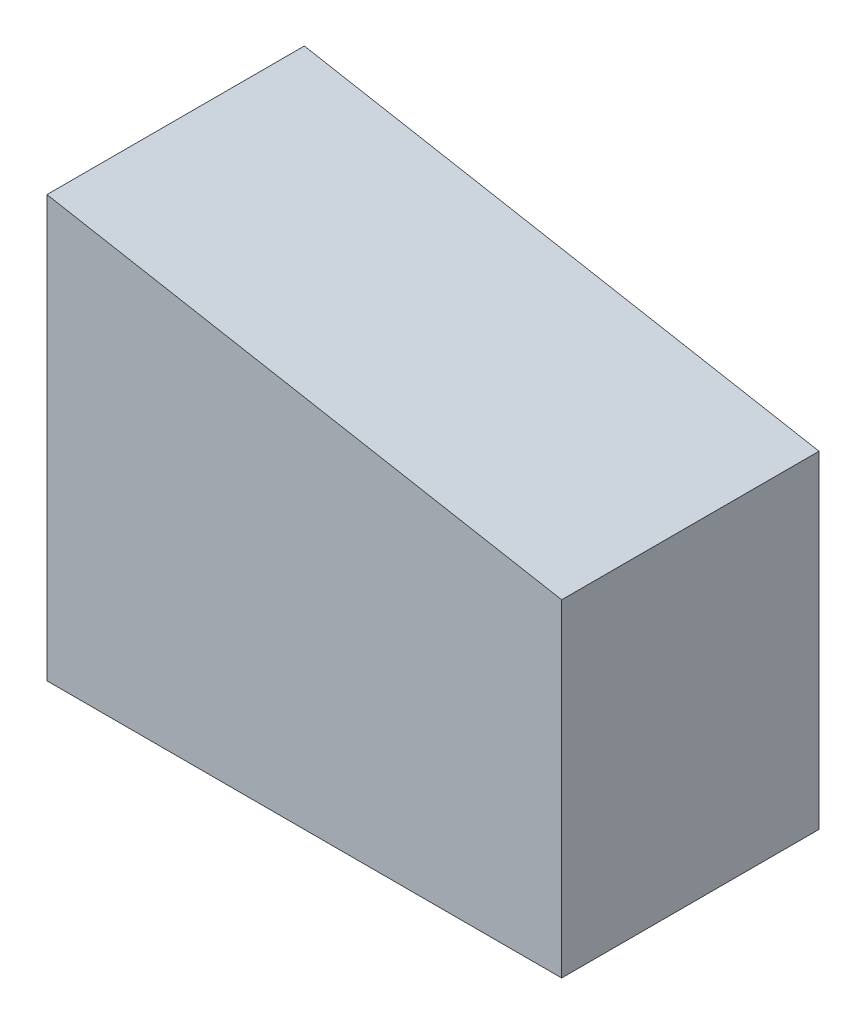
ISO-10303-21;
HEADER;
FILE_DESCRIPTION(('STEP AP214'),'2;1');
FILE_NAME('part.step','',(''),(''),'','','');
FILE_SCHEMA(('AUTOMOTIVE_DESIGN { 1 0 10303 214 1 1 1 1 }'));
ENDSEC;
DATA;
#1=APPLICATION_CONTEXT('core data for automotive mechanical design processes');
#2=APPLICATION_PROTOCOL_DEFINITION('international standard','automotive_design',2000,#1);
#3=PRODUCT_CONTEXT('',#1,'mechanical');
#4=PRODUCT('Part','Part','',(#3));
#5=PRODUCT_RELATED_PRODUCT_CATEGORY('part','',(#4));
#6=PRODUCT_DEFINITION_FORMATION('','',#4);
#7=PRODUCT_DEFINITION_CONTEXT('part definition',#1,'design');
#8=PRODUCT_DEFINITION('design','',#6,#7);
#9=PRODUCT_DEFINITION_SHAPE('','',#8);
#10=(LENGTH_UNIT() NAMED_UNIT(*) SI_UNIT(.MILLI.,.METRE.));
#11=(NAMED_UNIT(*) PLANE_ANGLE_UNIT() SI_UNIT($,.RADIAN.));
#12=(NAMED_UNIT(*) SI_UNIT($,.STERADIAN.) SOLID_ANGLE_UNIT());
#13=UNCERTAINTY_MEASURE_WITH_UNIT(LENGTH_MEASURE(1.E-05),#10,'distance_accuracy_value','');
#14=(GEOMETRIC_REPRESENTATION_CONTEXT(3) GLOBAL_UNCERTAINTY_ASSIGNED_CONTEXT((#13)) GLOBAL_UNIT_ASSIGNED_CONTEXT((#10,
#11,#12)) REPRESENTATION_CONTEXT('',''));
#15=CARTESIAN_POINT('',(0.,0.,0.));
#16=DIRECTION('',(0.,0.,1.));
#17=DIRECTION('',(1.,0.,0.));
#18=AXIS2_PLACEMENT_3D('',#15,#16,#17);
#19=CARTESIAN_POINT('',(0.,9.,5.5));
#20=DIRECTION('',(1.,0.,0.));
#21=DIRECTION('',(0.,1.,0.));
#22=AXIS2_PLACEMENT_3D('',#19,#20,#21);
#23=PLANE('',#22);
#24=DIRECTION('',(0.,-1.,0.));
#25=VECTOR('',#24,1.);
#26=CARTESIAN_POINT('',(0.,9.,0.));
#27=LINE('',#26,#25);
#28=CARTESIAN_POINT('',(0.,9.,0.));
#29=VERTEX_POINT('',#28);
#30=CARTESIAN_POINT('',(0.,0.,0.));
#31=VERTEX_POINT('',#30);
#32=EDGE_CURVE('E96',#29,#31,#27,.T.);
#33=ORIENTED_EDGE('',*,*,#32,.T.);
#34=DIRECTION('',(0.,0.,-1.));
#35=VECTOR('',#34,1.);
#36=CARTESIAN_POINT('',(0.,0.,5.5));
#37=LINE('',#36,#35);
#38=CARTESIAN_POINT('',(0.,0.,5.5));
#39=VERTEX_POINT('',#38);
#40=EDGE_CURVE('E11',#39,#31,#37,.T.);
#41=ORIENTED_EDGE('',*,*,#40,.F.);
#42=DIRECTION('',(0.,-1.,0.));
#43=VECTOR('',#42,1.);
#44=CARTESIAN_POINT('',(0.,9.,5.5));
#45=LINE('',#44,#43);
#46=CARTESIAN_POINT('',(0.,9.,5.5));
#47=VERTEX_POINT('',#46);
#48=EDGE_CURVE('E84',#47,#39,#45,.T.);
#49=ORIENTED_EDGE('',*,*,#48,.F.);
#50=DIRECTION('',(0.,0.,-1.));
#51=VECTOR('',#50,1.);
#52=CARTESIAN_POINT('',(0.,9.,5.5));
#53=LINE('',#52,#51);
#54=EDGE_CURVE('E92',#47,#29,#53,.T.);
#55=ORIENTED_EDGE('',*,*,#54,.T.);
#56=EDGE_LOOP('',(#33,#41,#49,#55));
#57=FACE_BOUND('',#56,.T.);
#58=ADVANCED_FACE('F33',(#57),#23,.F.);
#59=CARTESIAN_POINT('',(0.,0.,5.5));
#60=DIRECTION('',(0.,1.,0.));
#61=DIRECTION('',(0.,0.,1.));
#62=AXIS2_PLACEMENT_3D('',#59,#60,#61);
#63=PLANE('',#62);
#64=DIRECTION('',(1.,0.,0.));
#65=VECTOR('',#64,1.);
#66=CARTESIAN_POINT('',(0.,0.,0.));
#67=LINE('',#66,#65);
#68=CARTESIAN_POINT('',(11.,0.,0.));
#69=VERTEX_POINT('',#68);
#70=EDGE_CURVE('E88',#31,#69,#67,.T.);
#71=ORIENTED_EDGE('',*,*,#70,.T.);
#72=DIRECTION('',(0.,0.,-1.));
#73=VECTOR('',#72,1.);
#74=CARTESIAN_POINT('',(11.,0.,5.5));
#75=LINE('',#74,#73);
#76=CARTESIAN_POINT('',(11.,0.,5.5));
#77=VERTEX_POINT('',#76);
#78=EDGE_CURVE('E41',#77,#69,#75,.T.);
#79=ORIENTED_EDGE('',*,*,#78,.F.);
#80=DIRECTION('',(1.,0.,0.));
#81=VECTOR('',#80,1.);
#82=CARTESIAN_POINT('',(0.,0.,5.5));
#83=LINE('',#82,#81);
#84=EDGE_CURVE('E79',#39,#77,#83,.T.);
#85=ORIENTED_EDGE('',*,*,#84,.F.);
#86=ORIENTED_EDGE('',*,*,#40,.T.);
#87=EDGE_LOOP('',(#71,#79,#85,#86));
#88=FACE_BOUND('',#87,.T.);
#89=ADVANCED_FACE('F87',(#88),#63,.F.);
#90=CARTESIAN_POINT('',(11.,0.,5.5));
#91=DIRECTION('',(-1.,0.,0.));
#92=DIRECTION('',(0.,0.,1.));
#93=AXIS2_PLACEMENT_3D('',#90,#91,#92);
#94=PLANE('',#93);
#95=DIRECTION('',(0.,1.,0.));
#96=VECTOR('',#95,1.);
#97=CARTESIAN_POINT('',(11.,0.,0.));
#98=LINE('',#97,#96);
#99=CARTESIAN_POINT('',(11.,7.,0.));
#100=VERTEX_POINT('',#99);
#101=EDGE_CURVE('E66',#69,#100,#98,.T.);
#102=ORIENTED_EDGE('',*,*,#101,.T.);
#103=DIRECTION('',(0.,0.,-1.));
#104=VECTOR('',#103,1.);
#105=CARTESIAN_POINT('',(11.,7.,5.5));
#106=LINE('',#105,#104);
#107=CARTESIAN_POINT('',(11.,7.,5.5));
#108=VERTEX_POINT('',#107);
#109=EDGE_CURVE('E89',#108,#100,#106,.T.);
#110=ORIENTED_EDGE('',*,*,#109,.F.);
#111=DIRECTION('',(0.,1.,0.));
#112=VECTOR('',#111,1.);
#113=CARTESIAN_POINT('',(11.,0.,5.5));
#114=LINE('',#113,#112);
#115=EDGE_CURVE('E82',#77,#108,#114,.T.);
#116=ORIENTED_EDGE('',*,*,#115,.F.);
#117=ORIENTED_EDGE('',*,*,#78,.T.);
#118=EDGE_LOOP('',(#102,#110,#116,#117));
#119=FACE_BOUND('',#118,.T.);
#120=ADVANCED_FACE('F90',(#119),#94,.F.);
#121=CARTESIAN_POINT('',(11.,7.,5.5));
#122=DIRECTION('',(-0.178885438199983,-0.983869910099908,0.));
#123=DIRECTION('',(0.983869910099908,-0.178885438199983,0.));
#124=AXIS2_PLACEMENT_3D('',#121,#122,#123);
#125=PLANE('',#124);
#126=DIRECTION('',(-0.983869910099908,0.178885438199983,0.));
#127=VECTOR('',#126,1.);
#128=CARTESIAN_POINT('',(11.,7.,0.));
#129=LINE('',#128,#127);
#130=EDGE_CURVE('E72',#100,#29,#129,.T.);
#131=ORIENTED_EDGE('',*,*,#130,.T.);
#132=ORIENTED_EDGE('',*,*,#54,.F.);
#133=DIRECTION('',(-0.983869910099908,0.178885438199983,0.));
#134=VECTOR('',#133,1.);
#135=CARTESIAN_POINT('',(11.,7.,5.5));
#136=LINE('',#135,#134);
#137=EDGE_CURVE('E49',#108,#47,#136,.T.);
#138=ORIENTED_EDGE('',*,*,#137,.F.);
#139=ORIENTED_EDGE('',*,*,#109,.T.);
#140=EDGE_LOOP('',(#131,#132,#138,#139));
#141=FACE_BOUND('',#140,.T.);
#142=ADVANCED_FACE('F103',(#141),#125,.F.);
#143=CARTESIAN_POINT('',(0.,0.,5.5));
#144=DIRECTION('',(0.,0.,1.));
#145=DIRECTION('',(1.,0.,0.));
#146=AXIS2_PLACEMENT_3D('',#143,#144,#145);
#147=PLANE('',#146);
#148=ORIENTED_EDGE('',*,*,#48,.T.);
#149=ORIENTED_EDGE('',*,*,#84,.T.);
#150=ORIENTED_EDGE('',*,*,#115,.T.);
#151=ORIENTED_EDGE('',*,*,#137,.T.);
#152=EDGE_LOOP('',(#148,#149,#150,#151));
#153=FACE_BOUND('',#152,.T.);
#154=ADVANCED_FACE('F80',(#153),#147,.T.);
#155=CARTESIAN_POINT('',(0.,0.,0.));
#156=DIRECTION('',(0.,0.,1.));
#157=DIRECTION('',(1.,0.,0.));
#158=AXIS2_PLACEMENT_3D('',#155,#156,#157);
#159=PLANE('',#158);
#160=ORIENTED_EDGE('',*,*,#32,.F.);
#161=ORIENTED_EDGE('',*,*,#130,.F.);
#162=ORIENTED_EDGE('',*,*,#101,.F.);
#163=ORIENTED_EDGE('',*,*,#70,.F.);
#164=EDGE_LOOP('',(#160,#161,#162,#163));
#165=FACE_BOUND('',#164,.T.);
#166=ADVANCED_FACE('F106',(#165),#159,.F.);
#167=CLOSED_SHELL('',(#58,#89,#120,#142,#154,#166));
#168=MANIFOLD_SOLID_BREP('B2',#167);
#169=ADVANCED_BREP_SHAPE_REPRESENTATION('',(#18,#168),#14);
#170=SHAPE_DEFINITION_REPRESENTATION(#9,#169);
ENDSEC;
END-ISO-10303-21;
